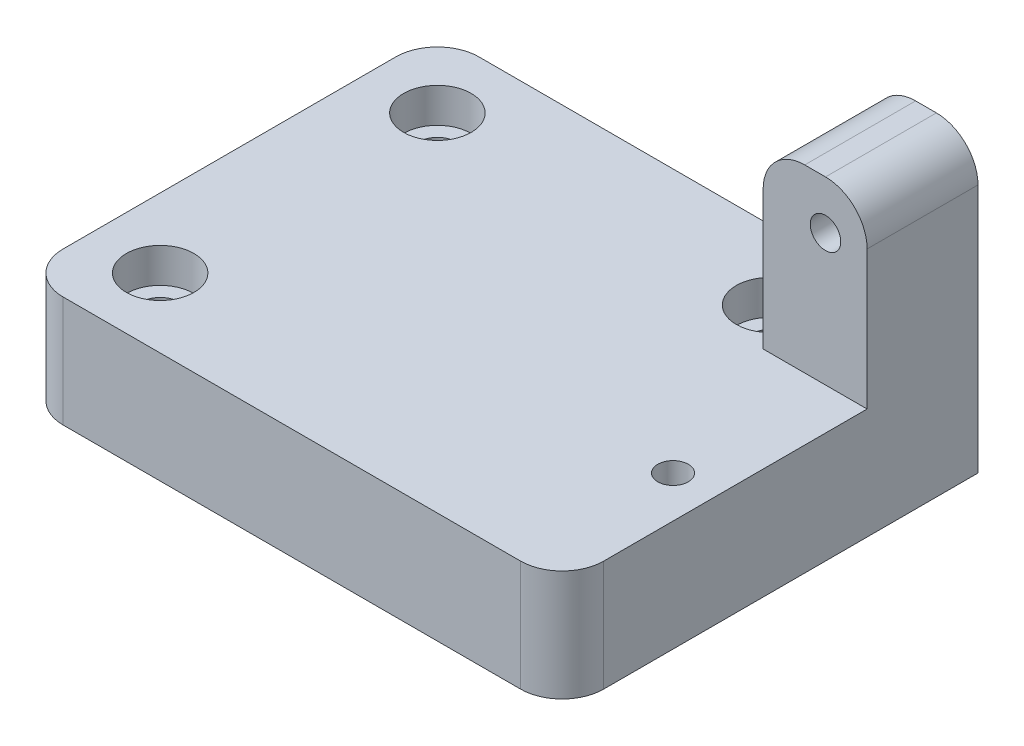
ISO-10303-21;
HEADER;
FILE_DESCRIPTION(('STEP AP214'),'2;1');
FILE_NAME('part.step','',(''),(''),'','','');
FILE_SCHEMA(('AUTOMOTIVE_DESIGN { 1 0 10303 214 1 1 1 1 }'));
ENDSEC;
DATA;
#1=APPLICATION_CONTEXT('core data for automotive mechanical design processes');
#2=APPLICATION_PROTOCOL_DEFINITION('international standard','automotive_design',2000,#1);
#3=PRODUCT_CONTEXT('',#1,'mechanical');
#4=PRODUCT('Part','Part','',(#3));
#5=PRODUCT_RELATED_PRODUCT_CATEGORY('part','',(#4));
#6=PRODUCT_DEFINITION_FORMATION('','',#4);
#7=PRODUCT_DEFINITION_CONTEXT('part definition',#1,'design');
#8=PRODUCT_DEFINITION('design','',#6,#7);
#9=PRODUCT_DEFINITION_SHAPE('','',#8);
#10=(LENGTH_UNIT() NAMED_UNIT(*) SI_UNIT(.MILLI.,.METRE.));
#11=(NAMED_UNIT(*) PLANE_ANGLE_UNIT() SI_UNIT($,.RADIAN.));
#12=(NAMED_UNIT(*) SI_UNIT($,.STERADIAN.) SOLID_ANGLE_UNIT());
#13=UNCERTAINTY_MEASURE_WITH_UNIT(LENGTH_MEASURE(1.E-05),#10,'distance_accuracy_value','');
#14=(GEOMETRIC_REPRESENTATION_CONTEXT(3) GLOBAL_UNCERTAINTY_ASSIGNED_CONTEXT((#13)) GLOBAL_UNIT_ASSIGNED_CONTEXT((#10,
#11,#12)) REPRESENTATION_CONTEXT('',''));
#15=CARTESIAN_POINT('',(0.,0.,0.));
#16=DIRECTION('',(0.,0.,1.));
#17=DIRECTION('',(1.,0.,0.));
#18=AXIS2_PLACEMENT_3D('',#15,#16,#17);
#19=CARTESIAN_POINT('',(-460.060652388512,228.071051768843,485.375));
#20=DIRECTION('',(0.,0.,1.));
#21=DIRECTION('',(1.,0.,0.));
#22=AXIS2_PLACEMENT_3D('',#19,#20,#21);
#23=PLANE('',#22);
#24=CARTESIAN_POINT('',(-430.810652388512,228.071051768843,485.375));
#25=DIRECTION('',(0.,0.,-1.));
#26=DIRECTION('',(-1.,0.,0.));
#27=AXIS2_PLACEMENT_3D('',#24,#25,#26);
#28=CIRCLE('',#27,4.125);
#29=CARTESIAN_POINT('',(-434.935652388512,228.071051768843,485.375));
#30=VERTEX_POINT('',#29);
#31=EDGE_CURVE('E171',#30,#30,#28,.T.);
#32=ORIENTED_EDGE('',*,*,#31,.T.);
#33=EDGE_LOOP('',(#32));
#34=FACE_BOUND('',#33,.T.);
#35=CARTESIAN_POINT('',(-430.810652388512,228.071051768843,485.375));
#36=DIRECTION('',(0.,0.,-1.));
#37=DIRECTION('',(-1.,0.,0.));
#38=AXIS2_PLACEMENT_3D('',#35,#36,#37);
#39=CIRCLE('',#38,2.2);
#40=CARTESIAN_POINT('',(-433.010652388512,228.071051768843,485.375));
#41=VERTEX_POINT('',#40);
#42=EDGE_CURVE('E20',#41,#41,#39,.F.);
#43=ORIENTED_EDGE('',*,*,#42,.T.);
#44=EDGE_LOOP('',(#43));
#45=FACE_BOUND('',#44,.T.);
#46=ADVANCED_FACE('F17',(#34,#45),#23,.F.);
#47=CARTESIAN_POINT('',(-444.810652388512,209.071051768843,491.375));
#48=DIRECTION('',(0.,1.,0.));
#49=DIRECTION('',(0.,0.,1.));
#50=AXIS2_PLACEMENT_3D('',#47,#48,#49);
#51=CYLINDRICAL_SURFACE('',#50,4.875);
#52=CARTESIAN_POINT('',(-444.810652388512,204.071051768843,491.375));
#53=DIRECTION('',(0.,1.,0.));
#54=DIRECTION('',(0.,0.,1.));
#55=AXIS2_PLACEMENT_3D('',#52,#53,#54);
#56=CIRCLE('',#55,4.875);
#57=CARTESIAN_POINT('',(-444.810652388512,204.071051768843,496.25));
#58=VERTEX_POINT('',#57);
#59=EDGE_CURVE('E240',#58,#58,#56,.F.);
#60=ORIENTED_EDGE('',*,*,#59,.T.);
#61=EDGE_LOOP('',(#60));
#62=FACE_BOUND('',#61,.T.);
#63=CARTESIAN_POINT('',(-444.810652388512,209.071051768843,491.375));
#64=DIRECTION('',(0.,1.,0.));
#65=DIRECTION('',(0.,0.,1.));
#66=AXIS2_PLACEMENT_3D('',#63,#64,#65);
#67=CIRCLE('',#66,4.875);
#68=CARTESIAN_POINT('',(-444.810652388512,209.071051768843,496.25));
#69=VERTEX_POINT('',#68);
#70=EDGE_CURVE('E160',#69,#69,#67,.F.);
#71=ORIENTED_EDGE('',*,*,#70,.F.);
#72=EDGE_LOOP('',(#71));
#73=FACE_BOUND('',#72,.T.);
#74=ADVANCED_FACE('F366',(#62,#73),#51,.F.);
#75=CARTESIAN_POINT('',(-492.810652388512,209.071051768843,491.375));
#76=DIRECTION('',(0.,1.,0.));
#77=DIRECTION('',(0.,0.,1.));
#78=AXIS2_PLACEMENT_3D('',#75,#76,#77);
#79=CYLINDRICAL_SURFACE('',#78,4.875);
#80=CARTESIAN_POINT('',(-492.810652388512,204.071051768843,491.375));
#81=DIRECTION('',(0.,1.,0.));
#82=DIRECTION('',(0.,0.,1.));
#83=AXIS2_PLACEMENT_3D('',#80,#81,#82);
#84=CIRCLE('',#83,4.875);
#85=CARTESIAN_POINT('',(-492.810652388512,204.071051768843,496.25));
#86=VERTEX_POINT('',#85);
#87=EDGE_CURVE('E238',#86,#86,#84,.F.);
#88=ORIENTED_EDGE('',*,*,#87,.T.);
#89=EDGE_LOOP('',(#88));
#90=FACE_BOUND('',#89,.T.);
#91=CARTESIAN_POINT('',(-492.810652388512,209.071051768843,491.375));
#92=DIRECTION('',(0.,1.,0.));
#93=DIRECTION('',(0.,0.,1.));
#94=AXIS2_PLACEMENT_3D('',#91,#92,#93);
#95=CIRCLE('',#94,4.875);
#96=CARTESIAN_POINT('',(-492.810652388512,209.071051768843,496.25));
#97=VERTEX_POINT('',#96);
#98=EDGE_CURVE('E225',#97,#97,#95,.F.);
#99=ORIENTED_EDGE('',*,*,#98,.F.);
#100=EDGE_LOOP('',(#99));
#101=FACE_BOUND('',#100,.T.);
#102=ADVANCED_FACE('F363',(#90,#101),#79,.F.);
#103=CARTESIAN_POINT('',(-492.810652388512,209.071051768843,531.375));
#104=DIRECTION('',(0.,1.,0.));
#105=DIRECTION('',(0.,0.,1.));
#106=AXIS2_PLACEMENT_3D('',#103,#104,#105);
#107=CYLINDRICAL_SURFACE('',#106,4.875);
#108=CARTESIAN_POINT('',(-492.810652388512,204.071051768843,531.375));
#109=DIRECTION('',(0.,1.,0.));
#110=DIRECTION('',(0.,0.,1.));
#111=AXIS2_PLACEMENT_3D('',#108,#109,#110);
#112=CIRCLE('',#111,4.875);
#113=CARTESIAN_POINT('',(-492.810652388512,204.071051768843,536.25));
#114=VERTEX_POINT('',#113);
#115=EDGE_CURVE('E235',#114,#114,#112,.F.);
#116=ORIENTED_EDGE('',*,*,#115,.T.);
#117=EDGE_LOOP('',(#116));
#118=FACE_BOUND('',#117,.T.);
#119=CARTESIAN_POINT('',(-492.810652388512,209.071051768843,531.375));
#120=DIRECTION('',(0.,1.,0.));
#121=DIRECTION('',(0.,0.,1.));
#122=AXIS2_PLACEMENT_3D('',#119,#120,#121);
#123=CIRCLE('',#122,4.875);
#124=CARTESIAN_POINT('',(-492.810652388512,209.071051768843,536.25));
#125=VERTEX_POINT('',#124);
#126=EDGE_CURVE('E222',#125,#125,#123,.F.);
#127=ORIENTED_EDGE('',*,*,#126,.F.);
#128=EDGE_LOOP('',(#127));
#129=FACE_BOUND('',#128,.T.);
#130=ADVANCED_FACE('F262',(#118,#129),#107,.F.);
#131=CARTESIAN_POINT('',(-430.810652388512,209.071051768843,519.375));
#132=DIRECTION('',(0.,1.,0.));
#133=DIRECTION('',(0.,0.,1.));
#134=AXIS2_PLACEMENT_3D('',#131,#132,#133);
#135=CYLINDRICAL_SURFACE('',#134,2.2);
#136=CARTESIAN_POINT('',(-430.810652388512,197.571051378526,519.375));
#137=DIRECTION('',(0.,1.,0.));
#138=DIRECTION('',(0.,0.,1.));
#139=AXIS2_PLACEMENT_3D('',#136,#137,#138);
#140=CIRCLE('',#139,2.2);
#141=CARTESIAN_POINT('',(-430.810652388512,197.571051378526,521.575));
#142=VERTEX_POINT('',#141);
#143=EDGE_CURVE('E232',#142,#142,#140,.T.);
#144=ORIENTED_EDGE('',*,*,#143,.F.);
#145=EDGE_LOOP('',(#144));
#146=FACE_BOUND('',#145,.T.);
#147=CARTESIAN_POINT('',(-430.810652388512,209.071051768843,519.375));
#148=DIRECTION('',(0.,1.,0.));
#149=DIRECTION('',(0.,0.,1.));
#150=AXIS2_PLACEMENT_3D('',#147,#148,#149);
#151=CIRCLE('',#150,2.2);
#152=CARTESIAN_POINT('',(-430.810652388512,209.071051768843,521.575));
#153=VERTEX_POINT('',#152);
#154=EDGE_CURVE('E165',#153,#153,#151,.F.);
#155=ORIENTED_EDGE('',*,*,#154,.F.);
#156=EDGE_LOOP('',(#155));
#157=FACE_BOUND('',#156,.T.);
#158=ADVANCED_FACE('F251',(#146,#157),#135,.F.);
#159=CARTESIAN_POINT('',(-430.810652388512,228.071051768843,497.375));
#160=DIRECTION('',(0.,0.,-1.));
#161=DIRECTION('',(-1.,0.,0.));
#162=AXIS2_PLACEMENT_3D('',#159,#160,#161);
#163=CYLINDRICAL_SURFACE('',#162,2.2);
#164=CARTESIAN_POINT('',(-430.810652388512,228.071051768843,497.375));
#165=DIRECTION('',(0.,0.,-1.));
#166=DIRECTION('',(-1.,0.,0.));
#167=AXIS2_PLACEMENT_3D('',#164,#165,#166);
#168=CIRCLE('',#167,2.2);
#169=CARTESIAN_POINT('',(-433.010652388512,228.071051768843,497.375));
#170=VERTEX_POINT('',#169);
#171=EDGE_CURVE('E117',#170,#170,#168,.T.);
#172=ORIENTED_EDGE('',*,*,#171,.F.);
#173=EDGE_LOOP('',(#172));
#174=FACE_BOUND('',#173,.T.);
#175=ORIENTED_EDGE('',*,*,#42,.F.);
#176=EDGE_LOOP('',(#175));
#177=FACE_BOUND('',#176,.T.);
#178=ADVANCED_FACE('F248',(#174,#177),#163,.F.);
#179=CARTESIAN_POINT('',(-463.810652388512,204.071051768843,537.14124439898));
#180=DIRECTION('',(0.,-1.,0.));
#181=DIRECTION('',(0.,0.,-1.));
#182=AXIS2_PLACEMENT_3D('',#179,#180,#181);
#183=PLANE('',#182);
#184=ORIENTED_EDGE('',*,*,#59,.F.);
#185=EDGE_LOOP('',(#184));
#186=FACE_BOUND('',#185,.T.);
#187=CARTESIAN_POINT('',(-444.810652388512,204.071051768843,491.375));
#188=DIRECTION('',(0.,1.,0.));
#189=DIRECTION('',(0.,0.,1.));
#190=AXIS2_PLACEMENT_3D('',#187,#188,#189);
#191=CIRCLE('',#190,2.75);
#192=CARTESIAN_POINT('',(-444.810652388512,204.071051768843,494.125));
#193=VERTEX_POINT('',#192);
#194=EDGE_CURVE('E137',#193,#193,#191,.F.);
#195=ORIENTED_EDGE('',*,*,#194,.T.);
#196=EDGE_LOOP('',(#195));
#197=FACE_BOUND('',#196,.T.);
#198=ADVANCED_FACE('F250',(#186,#197),#183,.F.);
#199=CARTESIAN_POINT('',(-463.810652388512,204.071051768843,537.14124439898));
#200=DIRECTION('',(0.,-1.,0.));
#201=DIRECTION('',(0.,0.,-1.));
#202=AXIS2_PLACEMENT_3D('',#199,#200,#201);
#203=PLANE('',#202);
#204=ORIENTED_EDGE('',*,*,#87,.F.);
#205=EDGE_LOOP('',(#204));
#206=FACE_BOUND('',#205,.T.);
#207=CARTESIAN_POINT('',(-492.810652388512,204.071051768843,491.375));
#208=DIRECTION('',(0.,1.,0.));
#209=DIRECTION('',(0.,0.,1.));
#210=AXIS2_PLACEMENT_3D('',#207,#208,#209);
#211=CIRCLE('',#210,2.75);
#212=CARTESIAN_POINT('',(-492.810652388512,204.071051768843,494.125));
#213=VERTEX_POINT('',#212);
#214=EDGE_CURVE('E211',#213,#213,#211,.F.);
#215=ORIENTED_EDGE('',*,*,#214,.T.);
#216=EDGE_LOOP('',(#215));
#217=FACE_BOUND('',#216,.T.);
#218=ADVANCED_FACE('F259',(#206,#217),#203,.F.);
#219=CARTESIAN_POINT('',(-463.810652388512,204.071051768843,537.14124439898));
#220=DIRECTION('',(0.,-1.,0.));
#221=DIRECTION('',(0.,0.,-1.));
#222=AXIS2_PLACEMENT_3D('',#219,#220,#221);
#223=PLANE('',#222);
#224=ORIENTED_EDGE('',*,*,#115,.F.);
#225=EDGE_LOOP('',(#224));
#226=FACE_BOUND('',#225,.T.);
#227=CARTESIAN_POINT('',(-492.810652388512,204.071051768843,531.375));
#228=DIRECTION('',(0.,1.,0.));
#229=DIRECTION('',(0.,0.,1.));
#230=AXIS2_PLACEMENT_3D('',#227,#228,#229);
#231=CIRCLE('',#230,2.75);
#232=CARTESIAN_POINT('',(-492.810652388512,204.071051768843,534.125));
#233=VERTEX_POINT('',#232);
#234=EDGE_CURVE('E208',#233,#233,#231,.F.);
#235=ORIENTED_EDGE('',*,*,#234,.T.);
#236=EDGE_LOOP('',(#235));
#237=FACE_BOUND('',#236,.T.);
#238=ADVANCED_FACE('F344',(#226,#237),#223,.F.);
#239=CARTESIAN_POINT('',(-424.810652388512,197.571051378526,536.3225));
#240=DIRECTION('',(0.,-1.,0.));
#241=DIRECTION('',(0.,0.,-1.));
#242=AXIS2_PLACEMENT_3D('',#239,#240,#241);
#243=PLANE('',#242);
#244=CARTESIAN_POINT('',(-430.810652388512,197.571051378526,519.375));
#245=DIRECTION('',(0.,-1.,0.));
#246=DIRECTION('',(0.,0.,-1.));
#247=AXIS2_PLACEMENT_3D('',#244,#245,#246);
#248=CIRCLE('',#247,4.125);
#249=CARTESIAN_POINT('',(-430.810652388512,197.571051378526,515.25));
#250=VERTEX_POINT('',#249);
#251=EDGE_CURVE('E205',#250,#250,#248,.T.);
#252=ORIENTED_EDGE('',*,*,#251,.T.);
#253=EDGE_LOOP('',(#252));
#254=FACE_BOUND('',#253,.T.);
#255=ORIENTED_EDGE('',*,*,#143,.T.);
#256=EDGE_LOOP('',(#255));
#257=FACE_BOUND('',#256,.T.);
#258=ADVANCED_FACE('F340',(#254,#257),#243,.T.);
#259=CARTESIAN_POINT('',(-430.810652388512,228.071051768843,481.5));
#260=DIRECTION('',(0.,0.,-1.));
#261=DIRECTION('',(-1.,0.,0.));
#262=AXIS2_PLACEMENT_3D('',#259,#260,#261);
#263=CYLINDRICAL_SURFACE('',#262,4.125);
#264=CARTESIAN_POINT('',(-430.810652388512,228.071051768843,481.375));
#265=DIRECTION('',(0.,0.,-1.));
#266=DIRECTION('',(-1.,0.,0.));
#267=AXIS2_PLACEMENT_3D('',#264,#265,#266);
#268=CIRCLE('',#267,4.125);
#269=CARTESIAN_POINT('',(-434.935652388512,228.071051768843,481.375));
#270=VERTEX_POINT('',#269);
#271=EDGE_CURVE('E202',#270,#270,#268,.T.);
#272=ORIENTED_EDGE('',*,*,#271,.T.);
#273=EDGE_LOOP('',(#272));
#274=FACE_BOUND('',#273,.T.);
#275=ORIENTED_EDGE('',*,*,#31,.F.);
#276=EDGE_LOOP('',(#275));
#277=FACE_BOUND('',#276,.T.);
#278=ADVANCED_FACE('F336',(#274,#277),#263,.F.);
#279=CARTESIAN_POINT('',(-513.810652388512,235.071051768843,416.875));
#280=DIRECTION('',(0.,1.,0.));
#281=DIRECTION('',(0.,0.,1.));
#282=AXIS2_PLACEMENT_3D('',#279,#280,#281);
#283=PLANE('',#282);
#284=DIRECTION('',(1.,0.,0.));
#285=VECTOR('',#284,1.);
#286=CARTESIAN_POINT('',(-460.060652388512,235.071051768843,481.375));
#287=LINE('',#286,#285);
#288=CARTESIAN_POINT('',(-430.810652388512,235.071051768843,481.375));
#289=VERTEX_POINT('',#288);
#290=CARTESIAN_POINT('',(-433.810652388512,235.071051768843,481.375));
#291=VERTEX_POINT('',#290);
#292=EDGE_CURVE('E201',#289,#291,#287,.F.);
#293=ORIENTED_EDGE('',*,*,#292,.T.);
#294=DIRECTION('',(0.,0.,-1.));
#295=VECTOR('',#294,1.);
#296=CARTESIAN_POINT('',(-433.810652388512,235.071051768843,502.888985006877));
#297=LINE('',#296,#295);
#298=CARTESIAN_POINT('',(-433.810652388512,235.071051768843,497.375));
#299=VERTEX_POINT('',#298);
#300=EDGE_CURVE('E169',#299,#291,#297,.T.);
#301=ORIENTED_EDGE('',*,*,#300,.F.);
#302=DIRECTION('',(1.,0.,0.));
#303=VECTOR('',#302,1.);
#304=CARTESIAN_POINT('',(-424.810652388512,235.071051768843,497.375));
#305=LINE('',#304,#303);
#306=CARTESIAN_POINT('',(-430.810652388512,235.071051768843,497.375));
#307=VERTEX_POINT('',#306);
#308=EDGE_CURVE('E116',#307,#299,#305,.F.);
#309=ORIENTED_EDGE('',*,*,#308,.F.);
#310=DIRECTION('',(0.,0.,1.));
#311=VECTOR('',#310,1.);
#312=CARTESIAN_POINT('',(-430.810652388512,235.071051768843,502.888985006877));
#313=LINE('',#312,#311);
#314=EDGE_CURVE('E113',#289,#307,#313,.T.);
#315=ORIENTED_EDGE('',*,*,#314,.F.);
#316=EDGE_LOOP('',(#293,#301,#309,#315));
#317=FACE_BOUND('',#316,.T.);
#318=ADVANCED_FACE('F332',(#317),#283,.T.);
#319=CARTESIAN_POINT('',(-433.810652388512,229.071051768843,502.888985006877));
#320=DIRECTION('',(0.,0.,-1.));
#321=DIRECTION('',(-1.,0.,0.));
#322=AXIS2_PLACEMENT_3D('',#319,#320,#321);
#323=CYLINDRICAL_SURFACE('',#322,6.);
#324=CARTESIAN_POINT('',(-433.810652388512,229.071051768843,497.375));
#325=DIRECTION('',(0.,0.,-1.));
#326=DIRECTION('',(-1.,0.,0.));
#327=AXIS2_PLACEMENT_3D('',#324,#325,#326);
#328=CIRCLE('',#327,6.);
#329=CARTESIAN_POINT('',(-439.810652388512,229.071051768843,497.375));
#330=VERTEX_POINT('',#329);
#331=EDGE_CURVE('E216',#299,#330,#328,.F.);
#332=ORIENTED_EDGE('',*,*,#331,.F.);
#333=ORIENTED_EDGE('',*,*,#300,.T.);
#334=CARTESIAN_POINT('',(-433.810652388512,229.071051768843,481.375));
#335=DIRECTION('',(0.,0.,-1.));
#336=DIRECTION('',(-1.,0.,0.));
#337=AXIS2_PLACEMENT_3D('',#334,#335,#336);
#338=CIRCLE('',#337,6.);
#339=CARTESIAN_POINT('',(-439.810652388512,229.071051768843,481.375));
#340=VERTEX_POINT('',#339);
#341=EDGE_CURVE('E198',#291,#340,#338,.F.);
#342=ORIENTED_EDGE('',*,*,#341,.T.);
#343=DIRECTION('',(0.,0.,1.));
#344=VECTOR('',#343,1.);
#345=CARTESIAN_POINT('',(-439.810652388512,229.071051768843,502.888985006877));
#346=LINE('',#345,#344);
#347=EDGE_CURVE('E161',#330,#340,#346,.F.);
#348=ORIENTED_EDGE('',*,*,#347,.F.);
#349=EDGE_LOOP('',(#332,#333,#342,#348));
#350=FACE_BOUND('',#349,.T.);
#351=ADVANCED_FACE('F328',(#350),#323,.T.);
#352=CARTESIAN_POINT('',(-439.810652388512,226.161816350003,502.888985006877));
#353=DIRECTION('',(-1.,0.,0.));
#354=DIRECTION('',(0.,0.,1.));
#355=AXIS2_PLACEMENT_3D('',#352,#353,#354);
#356=PLANE('',#355);
#357=DIRECTION('',(0.,1.,0.));
#358=VECTOR('',#357,1.);
#359=CARTESIAN_POINT('',(-439.810652388512,247.071051768843,497.375));
#360=LINE('',#359,#358);
#361=CARTESIAN_POINT('',(-439.810652388512,209.071051768843,497.375));
#362=VERTEX_POINT('',#361);
#363=EDGE_CURVE('E138',#330,#362,#360,.F.);
#364=ORIENTED_EDGE('',*,*,#363,.F.);
#365=ORIENTED_EDGE('',*,*,#347,.T.);
#366=DIRECTION('',(0.,1.,0.));
#367=VECTOR('',#366,1.);
#368=CARTESIAN_POINT('',(-439.810652388512,228.071051768843,481.375));
#369=LINE('',#368,#367);
#370=CARTESIAN_POINT('',(-439.810652388512,209.071051768843,481.375));
#371=VERTEX_POINT('',#370);
#372=EDGE_CURVE('E156',#340,#371,#369,.F.);
#373=ORIENTED_EDGE('',*,*,#372,.T.);
#374=DIRECTION('',(0.,0.,1.));
#375=VECTOR('',#374,1.);
#376=CARTESIAN_POINT('',(-439.810652388512,209.071051768843,500.55));
#377=LINE('',#376,#375);
#378=EDGE_CURVE('E162',#362,#371,#377,.F.);
#379=ORIENTED_EDGE('',*,*,#378,.F.);
#380=EDGE_LOOP('',(#364,#365,#373,#379));
#381=FACE_BOUND('',#380,.T.);
#382=ADVANCED_FACE('F325',(#381),#356,.T.);
#383=CARTESIAN_POINT('',(-430.810652388512,229.071051768843,502.888985006877));
#384=DIRECTION('',(0.,0.,1.));
#385=DIRECTION('',(1.,0.,0.));
#386=AXIS2_PLACEMENT_3D('',#383,#384,#385);
#387=CYLINDRICAL_SURFACE('',#386,6.);
#388=CARTESIAN_POINT('',(-430.810652388512,229.071051768843,497.375));
#389=DIRECTION('',(0.,0.,1.));
#390=DIRECTION('',(1.,0.,0.));
#391=AXIS2_PLACEMENT_3D('',#388,#389,#390);
#392=CIRCLE('',#391,6.);
#393=CARTESIAN_POINT('',(-424.810652388512,229.071051768843,497.375));
#394=VERTEX_POINT('',#393);
#395=EDGE_CURVE('E110',#394,#307,#392,.T.);
#396=ORIENTED_EDGE('',*,*,#395,.F.);
#397=DIRECTION('',(0.,0.,1.));
#398=VECTOR('',#397,1.);
#399=CARTESIAN_POINT('',(-424.810652388512,229.071051768843,502.888985006877));
#400=LINE('',#399,#398);
#401=CARTESIAN_POINT('',(-424.810652388512,229.071051768843,481.375));
#402=VERTEX_POINT('',#401);
#403=EDGE_CURVE('E96',#394,#402,#400,.F.);
#404=ORIENTED_EDGE('',*,*,#403,.T.);
#405=CARTESIAN_POINT('',(-430.810652388512,229.071051768843,481.375));
#406=DIRECTION('',(0.,0.,1.));
#407=DIRECTION('',(1.,0.,0.));
#408=AXIS2_PLACEMENT_3D('',#405,#406,#407);
#409=CIRCLE('',#408,6.);
#410=EDGE_CURVE('E155',#402,#289,#409,.T.);
#411=ORIENTED_EDGE('',*,*,#410,.T.);
#412=ORIENTED_EDGE('',*,*,#314,.T.);
#413=EDGE_LOOP('',(#396,#404,#411,#412));
#414=FACE_BOUND('',#413,.T.);
#415=ADVANCED_FACE('F111',(#414),#387,.T.);
#416=CARTESIAN_POINT('',(-424.810652388512,209.071051768843,500.55));
#417=DIRECTION('',(0.,1.,0.));
#418=DIRECTION('',(0.,0.,1.));
#419=AXIS2_PLACEMENT_3D('',#416,#417,#418);
#420=PLANE('',#419);
#421=CARTESIAN_POINT('',(-430.810652388512,209.071051768843,535.375));
#422=DIRECTION('',(0.,-1.,0.));
#423=DIRECTION('',(0.,0.,-1.));
#424=AXIS2_PLACEMENT_3D('',#421,#422,#423);
#425=CIRCLE('',#424,6.);
#426=CARTESIAN_POINT('',(-424.810652388512,209.071051768843,535.375));
#427=VERTEX_POINT('',#426);
#428=CARTESIAN_POINT('',(-430.810652388512,209.071051768843,541.375));
#429=VERTEX_POINT('',#428);
#430=EDGE_CURVE('E191',#427,#429,#425,.T.);
#431=ORIENTED_EDGE('',*,*,#430,.F.);
#432=DIRECTION('',(0.,0.,1.));
#433=VECTOR('',#432,1.);
#434=CARTESIAN_POINT('',(-424.810652388512,209.071051768843,502.888985006877));
#435=LINE('',#434,#433);
#436=CARTESIAN_POINT('',(-424.810652388512,209.071051768843,497.375));
#437=VERTEX_POINT('',#436);
#438=EDGE_CURVE('E126',#427,#437,#435,.F.);
#439=ORIENTED_EDGE('',*,*,#438,.T.);
#440=DIRECTION('',(1.,0.,0.));
#441=VECTOR('',#440,1.);
#442=CARTESIAN_POINT('',(-424.810652388512,209.071051768843,497.375));
#443=LINE('',#442,#441);
#444=EDGE_CURVE('E124',#362,#437,#443,.T.);
#445=ORIENTED_EDGE('',*,*,#444,.F.);
#446=ORIENTED_EDGE('',*,*,#378,.T.);
#447=DIRECTION('',(1.,0.,0.));
#448=VECTOR('',#447,1.);
#449=CARTESIAN_POINT('',(-460.060652388512,209.071051768843,481.375));
#450=LINE('',#449,#448);
#451=CARTESIAN_POINT('',(-496.810652388512,209.071051768843,481.375));
#452=VERTEX_POINT('',#451);
#453=EDGE_CURVE('E152',#371,#452,#450,.F.);
#454=ORIENTED_EDGE('',*,*,#453,.T.);
#455=CARTESIAN_POINT('',(-496.810652388512,209.071051768843,487.375));
#456=DIRECTION('',(0.,1.,0.));
#457=DIRECTION('',(0.,0.,1.));
#458=AXIS2_PLACEMENT_3D('',#455,#456,#457);
#459=CIRCLE('',#458,6.);
#460=CARTESIAN_POINT('',(-502.810652388512,209.071051768843,487.375));
#461=VERTEX_POINT('',#460);
#462=EDGE_CURVE('E194',#461,#452,#459,.F.);
#463=ORIENTED_EDGE('',*,*,#462,.F.);
#464=DIRECTION('',(0.,0.,-1.));
#465=VECTOR('',#464,1.);
#466=CARTESIAN_POINT('',(-502.810652388512,209.071051768843,505.790570795974));
#467=LINE('',#466,#465);
#468=CARTESIAN_POINT('',(-502.810652388512,209.071051768843,535.375));
#469=VERTEX_POINT('',#468);
#470=EDGE_CURVE('E147',#461,#469,#467,.F.);
#471=ORIENTED_EDGE('',*,*,#470,.T.);
#472=CARTESIAN_POINT('',(-496.810652388512,209.071051768843,535.375));
#473=DIRECTION('',(0.,1.,0.));
#474=DIRECTION('',(0.,0.,1.));
#475=AXIS2_PLACEMENT_3D('',#472,#473,#474);
#476=CIRCLE('',#475,6.);
#477=CARTESIAN_POINT('',(-496.810652388512,209.071051768843,541.375));
#478=VERTEX_POINT('',#477);
#479=EDGE_CURVE('E150',#478,#469,#476,.F.);
#480=ORIENTED_EDGE('',*,*,#479,.F.);
#481=DIRECTION('',(1.,0.,0.));
#482=VECTOR('',#481,1.);
#483=CARTESIAN_POINT('',(-460.060652388512,209.071051768843,541.375));
#484=LINE('',#483,#482);
#485=EDGE_CURVE('E143',#429,#478,#484,.F.);
#486=ORIENTED_EDGE('',*,*,#485,.F.);
#487=EDGE_LOOP('',(#431,#439,#445,#446,#454,#463,#471,#480,#486));
#488=FACE_BOUND('',#487,.T.);
#489=ORIENTED_EDGE('',*,*,#154,.T.);
#490=EDGE_LOOP('',(#489));
#491=FACE_BOUND('',#490,.T.);
#492=ORIENTED_EDGE('',*,*,#126,.T.);
#493=EDGE_LOOP('',(#492));
#494=FACE_BOUND('',#493,.T.);
#495=ORIENTED_EDGE('',*,*,#98,.T.);
#496=EDGE_LOOP('',(#495));
#497=FACE_BOUND('',#496,.T.);
#498=ORIENTED_EDGE('',*,*,#70,.T.);
#499=EDGE_LOOP('',(#498));
#500=FACE_BOUND('',#499,.T.);
#501=ADVANCED_FACE('F319',(#488,#491,#494,#497,#500),#420,.T.);
#502=CARTESIAN_POINT('',(-424.810652388512,247.071051768843,497.375));
#503=DIRECTION('',(0.,0.,1.));
#504=DIRECTION('',(1.,0.,0.));
#505=AXIS2_PLACEMENT_3D('',#502,#503,#504);
#506=PLANE('',#505);
#507=ORIENTED_EDGE('',*,*,#363,.T.);
#508=ORIENTED_EDGE('',*,*,#444,.T.);
#509=DIRECTION('',(0.,1.,0.));
#510=VECTOR('',#509,1.);
#511=CARTESIAN_POINT('',(-424.810652388512,226.161816350003,497.375));
#512=LINE('',#511,#510);
#513=EDGE_CURVE('E100',#437,#394,#512,.T.);
#514=ORIENTED_EDGE('',*,*,#513,.T.);
#515=ORIENTED_EDGE('',*,*,#395,.T.);
#516=ORIENTED_EDGE('',*,*,#308,.T.);
#517=ORIENTED_EDGE('',*,*,#331,.T.);
#518=EDGE_LOOP('',(#507,#508,#514,#515,#516,#517));
#519=FACE_BOUND('',#518,.T.);
#520=ORIENTED_EDGE('',*,*,#171,.T.);
#521=EDGE_LOOP('',(#520));
#522=FACE_BOUND('',#521,.T.);
#523=ADVANCED_FACE('F121',(#519,#522),#506,.T.);
#524=CARTESIAN_POINT('',(-444.810652388512,180.467037539494,491.375));
#525=DIRECTION('',(0.,1.,0.));
#526=DIRECTION('',(0.,0.,1.));
#527=AXIS2_PLACEMENT_3D('',#524,#525,#526);
#528=CYLINDRICAL_SURFACE('',#527,2.75);
#529=ORIENTED_EDGE('',*,*,#194,.F.);
#530=EDGE_LOOP('',(#529));
#531=FACE_BOUND('',#530,.T.);
#532=CARTESIAN_POINT('',(-444.810652388512,193.071051768843,491.375));
#533=DIRECTION('',(0.,1.,0.));
#534=DIRECTION('',(0.,0.,1.));
#535=AXIS2_PLACEMENT_3D('',#532,#533,#534);
#536=CIRCLE('',#535,2.75);
#537=CARTESIAN_POINT('',(-444.810652388512,193.071051768843,494.125));
#538=VERTEX_POINT('',#537);
#539=EDGE_CURVE('E125',#538,#538,#536,.F.);
#540=ORIENTED_EDGE('',*,*,#539,.T.);
#541=EDGE_LOOP('',(#540));
#542=FACE_BOUND('',#541,.T.);
#543=ADVANCED_FACE('F312',(#531,#542),#528,.F.);
#544=CARTESIAN_POINT('',(-492.810652388512,180.467037539494,491.375));
#545=DIRECTION('',(0.,1.,0.));
#546=DIRECTION('',(0.,0.,1.));
#547=AXIS2_PLACEMENT_3D('',#544,#545,#546);
#548=CYLINDRICAL_SURFACE('',#547,2.75);
#549=ORIENTED_EDGE('',*,*,#214,.F.);
#550=EDGE_LOOP('',(#549));
#551=FACE_BOUND('',#550,.T.);
#552=CARTESIAN_POINT('',(-492.810652388512,193.071051768843,491.375));
#553=DIRECTION('',(0.,1.,0.));
#554=DIRECTION('',(0.,0.,1.));
#555=AXIS2_PLACEMENT_3D('',#552,#553,#554);
#556=CIRCLE('',#555,2.75);
#557=CARTESIAN_POINT('',(-492.810652388512,193.071051768843,494.125));
#558=VERTEX_POINT('',#557);
#559=EDGE_CURVE('E129',#558,#558,#556,.F.);
#560=ORIENTED_EDGE('',*,*,#559,.T.);
#561=EDGE_LOOP('',(#560));
#562=FACE_BOUND('',#561,.T.);
#563=ADVANCED_FACE('F308',(#551,#562),#548,.F.);
#564=CARTESIAN_POINT('',(-492.810652388512,180.467037539494,531.375));
#565=DIRECTION('',(0.,1.,0.));
#566=DIRECTION('',(0.,0.,1.));
#567=AXIS2_PLACEMENT_3D('',#564,#565,#566);
#568=CYLINDRICAL_SURFACE('',#567,2.75);
#569=ORIENTED_EDGE('',*,*,#234,.F.);
#570=EDGE_LOOP('',(#569));
#571=FACE_BOUND('',#570,.T.);
#572=CARTESIAN_POINT('',(-492.810652388512,193.071051768843,531.375));
#573=DIRECTION('',(0.,1.,0.));
#574=DIRECTION('',(0.,0.,1.));
#575=AXIS2_PLACEMENT_3D('',#572,#573,#574);
#576=CIRCLE('',#575,2.75);
#577=CARTESIAN_POINT('',(-492.810652388512,193.071051768843,534.125));
#578=VERTEX_POINT('',#577);
#579=EDGE_CURVE('E186',#578,#578,#576,.F.);
#580=ORIENTED_EDGE('',*,*,#579,.T.);
#581=EDGE_LOOP('',(#580));
#582=FACE_BOUND('',#581,.T.);
#583=ADVANCED_FACE('F304',(#571,#582),#568,.F.);
#584=CARTESIAN_POINT('',(-430.810652388512,185.547040378526,519.375));
#585=DIRECTION('',(0.,-1.,0.));
#586=DIRECTION('',(0.,0.,-1.));
#587=AXIS2_PLACEMENT_3D('',#584,#585,#586);
#588=CYLINDRICAL_SURFACE('',#587,4.125);
#589=CARTESIAN_POINT('',(-430.810652388512,193.071051768843,519.375));
#590=DIRECTION('',(0.,-1.,0.));
#591=DIRECTION('',(0.,0.,-1.));
#592=AXIS2_PLACEMENT_3D('',#589,#590,#591);
#593=CIRCLE('',#592,4.125);
#594=CARTESIAN_POINT('',(-430.810652388512,193.071051768843,515.25));
#595=VERTEX_POINT('',#594);
#596=EDGE_CURVE('E183',#595,#595,#593,.T.);
#597=ORIENTED_EDGE('',*,*,#596,.T.);
#598=EDGE_LOOP('',(#597));
#599=FACE_BOUND('',#598,.T.);
#600=ORIENTED_EDGE('',*,*,#251,.F.);
#601=EDGE_LOOP('',(#600));
#602=FACE_BOUND('',#601,.T.);
#603=ADVANCED_FACE('F300',(#599,#602),#588,.F.);
#604=CARTESIAN_POINT('',(-460.060652388512,228.071051768843,481.375));
#605=DIRECTION('',(0.,0.,1.));
#606=DIRECTION('',(1.,0.,0.));
#607=AXIS2_PLACEMENT_3D('',#604,#605,#606);
#608=PLANE('',#607);
#609=DIRECTION('',(0.,1.,0.));
#610=VECTOR('',#609,1.);
#611=CARTESIAN_POINT('',(-424.810652388512,226.161816350003,481.375));
#612=LINE('',#611,#610);
#613=CARTESIAN_POINT('',(-424.810652388512,193.071051768843,481.375));
#614=VERTEX_POINT('',#613);
#615=EDGE_CURVE('E103',#402,#614,#612,.F.);
#616=ORIENTED_EDGE('',*,*,#615,.T.);
#617=DIRECTION('',(1.,0.,0.));
#618=VECTOR('',#617,1.);
#619=CARTESIAN_POINT('',(-513.810652388512,193.071051768843,481.375));
#620=LINE('',#619,#618);
#621=CARTESIAN_POINT('',(-496.810652388512,193.071051768843,481.375));
#622=VERTEX_POINT('',#621);
#623=EDGE_CURVE('E182',#614,#622,#620,.F.);
#624=ORIENTED_EDGE('',*,*,#623,.T.);
#625=DIRECTION('',(0.,1.,0.));
#626=VECTOR('',#625,1.);
#627=CARTESIAN_POINT('',(-496.810652388512,226.161816350003,481.375));
#628=LINE('',#627,#626);
#629=EDGE_CURVE('E196',#452,#622,#628,.F.);
#630=ORIENTED_EDGE('',*,*,#629,.F.);
#631=ORIENTED_EDGE('',*,*,#453,.F.);
#632=ORIENTED_EDGE('',*,*,#372,.F.);
#633=ORIENTED_EDGE('',*,*,#341,.F.);
#634=ORIENTED_EDGE('',*,*,#292,.F.);
#635=ORIENTED_EDGE('',*,*,#410,.F.);
#636=EDGE_LOOP('',(#616,#624,#630,#631,#632,#633,#634,#635));
#637=FACE_BOUND('',#636,.T.);
#638=ORIENTED_EDGE('',*,*,#271,.F.);
#639=EDGE_LOOP('',(#638));
#640=FACE_BOUND('',#639,.T.);
#641=ADVANCED_FACE('F296',(#637,#640),#608,.F.);
#642=CARTESIAN_POINT('',(-496.810652388512,226.161816350003,487.375));
#643=DIRECTION('',(0.,1.,0.));
#644=DIRECTION('',(0.,0.,1.));
#645=AXIS2_PLACEMENT_3D('',#642,#643,#644);
#646=CYLINDRICAL_SURFACE('',#645,6.);
#647=CARTESIAN_POINT('',(-496.810652388512,193.071051768843,487.375));
#648=DIRECTION('',(0.,1.,0.));
#649=DIRECTION('',(0.,0.,1.));
#650=AXIS2_PLACEMENT_3D('',#647,#648,#649);
#651=CIRCLE('',#650,6.);
#652=CARTESIAN_POINT('',(-502.810652388512,193.071051768843,487.375));
#653=VERTEX_POINT('',#652);
#654=EDGE_CURVE('E179',#622,#653,#651,.T.);
#655=ORIENTED_EDGE('',*,*,#654,.T.);
#656=DIRECTION('',(0.,1.,0.));
#657=VECTOR('',#656,1.);
#658=CARTESIAN_POINT('',(-502.810652388512,205.067791480029,487.375));
#659=LINE('',#658,#657);
#660=EDGE_CURVE('E151',#653,#461,#659,.T.);
#661=ORIENTED_EDGE('',*,*,#660,.T.);
#662=ORIENTED_EDGE('',*,*,#462,.T.);
#663=ORIENTED_EDGE('',*,*,#629,.T.);
#664=EDGE_LOOP('',(#655,#661,#662,#663));
#665=FACE_BOUND('',#664,.T.);
#666=ADVANCED_FACE('F292',(#665),#646,.T.);
#667=CARTESIAN_POINT('',(-502.810652388512,205.067791480029,505.790570795974));
#668=DIRECTION('',(1.,0.,0.));
#669=DIRECTION('',(0.,0.,-1.));
#670=AXIS2_PLACEMENT_3D('',#667,#668,#669);
#671=PLANE('',#670);
#672=ORIENTED_EDGE('',*,*,#660,.F.);
#673=DIRECTION('',(0.,0.,1.));
#674=VECTOR('',#673,1.);
#675=CARTESIAN_POINT('',(-502.810652388512,193.071051768843,416.875));
#676=LINE('',#675,#674);
#677=CARTESIAN_POINT('',(-502.810652388512,193.071051768843,535.375));
#678=VERTEX_POINT('',#677);
#679=EDGE_CURVE('E178',#653,#678,#676,.T.);
#680=ORIENTED_EDGE('',*,*,#679,.T.);
#681=DIRECTION('',(0.,1.,0.));
#682=VECTOR('',#681,1.);
#683=CARTESIAN_POINT('',(-502.810652388512,226.161816350003,535.375));
#684=LINE('',#683,#682);
#685=EDGE_CURVE('E146',#469,#678,#684,.F.);
#686=ORIENTED_EDGE('',*,*,#685,.F.);
#687=ORIENTED_EDGE('',*,*,#470,.F.);
#688=EDGE_LOOP('',(#672,#680,#686,#687));
#689=FACE_BOUND('',#688,.T.);
#690=ADVANCED_FACE('F288',(#689),#671,.F.);
#691=CARTESIAN_POINT('',(-496.810652388512,226.161816350003,535.375));
#692=DIRECTION('',(0.,1.,0.));
#693=DIRECTION('',(0.,0.,1.));
#694=AXIS2_PLACEMENT_3D('',#691,#692,#693);
#695=CYLINDRICAL_SURFACE('',#694,6.);
#696=ORIENTED_EDGE('',*,*,#479,.T.);
#697=ORIENTED_EDGE('',*,*,#685,.T.);
#698=CARTESIAN_POINT('',(-496.810652388512,193.071051768843,535.375));
#699=DIRECTION('',(0.,1.,0.));
#700=DIRECTION('',(0.,0.,1.));
#701=AXIS2_PLACEMENT_3D('',#698,#699,#700);
#702=CIRCLE('',#701,6.);
#703=CARTESIAN_POINT('',(-496.810652388512,193.071051768843,541.375));
#704=VERTEX_POINT('',#703);
#705=EDGE_CURVE('E175',#678,#704,#702,.T.);
#706=ORIENTED_EDGE('',*,*,#705,.T.);
#707=DIRECTION('',(0.,1.,0.));
#708=VECTOR('',#707,1.);
#709=CARTESIAN_POINT('',(-496.810652388512,228.071051768843,541.375));
#710=LINE('',#709,#708);
#711=EDGE_CURVE('E145',#478,#704,#710,.F.);
#712=ORIENTED_EDGE('',*,*,#711,.F.);
#713=EDGE_LOOP('',(#696,#697,#706,#712));
#714=FACE_BOUND('',#713,.T.);
#715=ADVANCED_FACE('F284',(#714),#695,.T.);
#716=CARTESIAN_POINT('',(-460.060652388512,228.071051768843,541.375));
#717=DIRECTION('',(0.,0.,1.));
#718=DIRECTION('',(1.,0.,0.));
#719=AXIS2_PLACEMENT_3D('',#716,#717,#718);
#720=PLANE('',#719);
#721=ORIENTED_EDGE('',*,*,#711,.T.);
#722=DIRECTION('',(1.,0.,0.));
#723=VECTOR('',#722,1.);
#724=CARTESIAN_POINT('',(-513.810652388512,193.071051768843,541.375));
#725=LINE('',#724,#723);
#726=CARTESIAN_POINT('',(-430.810652388512,193.071051768843,541.375));
#727=VERTEX_POINT('',#726);
#728=EDGE_CURVE('E174',#704,#727,#725,.T.);
#729=ORIENTED_EDGE('',*,*,#728,.T.);
#730=DIRECTION('',(0.,-1.,0.));
#731=VECTOR('',#730,1.);
#732=CARTESIAN_POINT('',(-430.810652388512,226.161816350003,541.375));
#733=LINE('',#732,#731);
#734=EDGE_CURVE('E106',#429,#727,#733,.T.);
#735=ORIENTED_EDGE('',*,*,#734,.F.);
#736=ORIENTED_EDGE('',*,*,#485,.T.);
#737=EDGE_LOOP('',(#721,#729,#735,#736));
#738=FACE_BOUND('',#737,.T.);
#739=ADVANCED_FACE('F280',(#738),#720,.T.);
#740=CARTESIAN_POINT('',(-430.810652388512,226.161816350003,535.375));
#741=DIRECTION('',(0.,-1.,0.));
#742=DIRECTION('',(0.,0.,-1.));
#743=AXIS2_PLACEMENT_3D('',#740,#741,#742);
#744=CYLINDRICAL_SURFACE('',#743,6.);
#745=CARTESIAN_POINT('',(-430.810652388512,193.071051768843,535.375));
#746=DIRECTION('',(0.,-1.,0.));
#747=DIRECTION('',(0.,0.,-1.));
#748=AXIS2_PLACEMENT_3D('',#745,#746,#747);
#749=CIRCLE('',#748,6.);
#750=CARTESIAN_POINT('',(-424.810652388512,193.071051768843,535.375));
#751=VERTEX_POINT('',#750);
#752=EDGE_CURVE('E26',#727,#751,#749,.F.);
#753=ORIENTED_EDGE('',*,*,#752,.T.);
#754=DIRECTION('',(0.,1.,0.));
#755=VECTOR('',#754,1.);
#756=CARTESIAN_POINT('',(-424.810652388512,226.161816350003,535.375));
#757=LINE('',#756,#755);
#758=EDGE_CURVE('E34',#751,#427,#757,.T.);
#759=ORIENTED_EDGE('',*,*,#758,.T.);
#760=ORIENTED_EDGE('',*,*,#430,.T.);
#761=ORIENTED_EDGE('',*,*,#734,.T.);
#762=EDGE_LOOP('',(#753,#759,#760,#761));
#763=FACE_BOUND('',#762,.T.);
#764=ADVANCED_FACE('F273',(#763),#744,.T.);
#765=CARTESIAN_POINT('',(-424.810652388512,226.161816350003,502.888985006877));
#766=DIRECTION('',(-1.,0.,0.));
#767=DIRECTION('',(0.,0.,1.));
#768=AXIS2_PLACEMENT_3D('',#765,#766,#767);
#769=PLANE('',#768);
#770=ORIENTED_EDGE('',*,*,#438,.F.);
#771=ORIENTED_EDGE('',*,*,#758,.F.);
#772=DIRECTION('',(0.,0.,1.));
#773=VECTOR('',#772,1.);
#774=CARTESIAN_POINT('',(-424.810652388512,193.071051768843,416.875));
#775=LINE('',#774,#773);
#776=EDGE_CURVE('E11',#751,#614,#775,.F.);
#777=ORIENTED_EDGE('',*,*,#776,.T.);
#778=ORIENTED_EDGE('',*,*,#615,.F.);
#779=ORIENTED_EDGE('',*,*,#403,.F.);
#780=ORIENTED_EDGE('',*,*,#513,.F.);
#781=EDGE_LOOP('',(#770,#771,#777,#778,#779,#780));
#782=FACE_BOUND('',#781,.T.);
#783=ADVANCED_FACE('F98',(#782),#769,.F.);
#784=CARTESIAN_POINT('',(-513.810652388512,193.071051768843,416.875));
#785=DIRECTION('',(0.,1.,0.));
#786=DIRECTION('',(0.,0.,1.));
#787=AXIS2_PLACEMENT_3D('',#784,#785,#786);
#788=PLANE('',#787);
#789=ORIENTED_EDGE('',*,*,#752,.F.);
#790=ORIENTED_EDGE('',*,*,#728,.F.);
#791=ORIENTED_EDGE('',*,*,#705,.F.);
#792=ORIENTED_EDGE('',*,*,#679,.F.);
#793=ORIENTED_EDGE('',*,*,#654,.F.);
#794=ORIENTED_EDGE('',*,*,#623,.F.);
#795=ORIENTED_EDGE('',*,*,#776,.F.);
#796=EDGE_LOOP('',(#789,#790,#791,#792,#793,#794,#795));
#797=FACE_BOUND('',#796,.T.);
#798=ORIENTED_EDGE('',*,*,#596,.F.);
#799=EDGE_LOOP('',(#798));
#800=FACE_BOUND('',#799,.T.);
#801=ORIENTED_EDGE('',*,*,#579,.F.);
#802=EDGE_LOOP('',(#801));
#803=FACE_BOUND('',#802,.T.);
#804=ORIENTED_EDGE('',*,*,#559,.F.);
#805=EDGE_LOOP('',(#804));
#806=FACE_BOUND('',#805,.T.);
#807=ORIENTED_EDGE('',*,*,#539,.F.);
#808=EDGE_LOOP('',(#807));
#809=FACE_BOUND('',#808,.T.);
#810=ADVANCED_FACE('F266',(#797,#800,#803,#806,#809),#788,.F.);
#811=CLOSED_SHELL('',(#46,#74,#102,#130,#158,#178,#198,#218,#238,#258,#278,#318,#351,#382,#415,
#501,#523,#543,#563,#583,#603,#641,#666,#690,#715,#739,#764,#783,#810));
#812=MANIFOLD_SOLID_BREP('B1',#811);
#813=ADVANCED_BREP_SHAPE_REPRESENTATION('',(#18,#812),#14);
#814=SHAPE_DEFINITION_REPRESENTATION(#9,#813);
ENDSEC;
END-ISO-10303-21;
